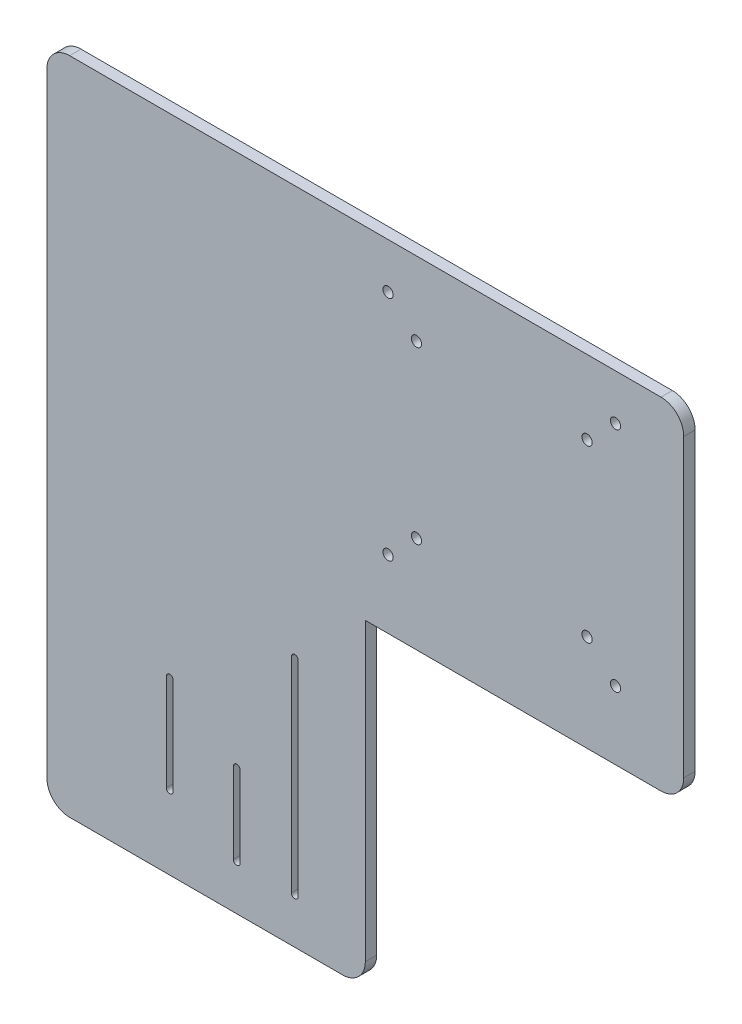
ISO-10303-21;
HEADER;
FILE_DESCRIPTION(('STEP AP214'),'2;1');
FILE_NAME('part.step','',(''),(''),'','','');
FILE_SCHEMA(('AUTOMOTIVE_DESIGN { 1 0 10303 214 1 1 1 1 }'));
ENDSEC;
DATA;
#1=APPLICATION_CONTEXT('core data for automotive mechanical design processes');
#2=APPLICATION_PROTOCOL_DEFINITION('international standard','automotive_design',2000,#1);
#3=PRODUCT_CONTEXT('',#1,'mechanical');
#4=PRODUCT('Part','Part','',(#3));
#5=PRODUCT_RELATED_PRODUCT_CATEGORY('part','',(#4));
#6=PRODUCT_DEFINITION_FORMATION('','',#4);
#7=PRODUCT_DEFINITION_CONTEXT('part definition',#1,'design');
#8=PRODUCT_DEFINITION('design','',#6,#7);
#9=PRODUCT_DEFINITION_SHAPE('','',#8);
#10=(LENGTH_UNIT() NAMED_UNIT(*) SI_UNIT(.MILLI.,.METRE.));
#11=(NAMED_UNIT(*) PLANE_ANGLE_UNIT() SI_UNIT($,.RADIAN.));
#12=(NAMED_UNIT(*) SI_UNIT($,.STERADIAN.) SOLID_ANGLE_UNIT());
#13=UNCERTAINTY_MEASURE_WITH_UNIT(LENGTH_MEASURE(1.E-05),#10,'distance_accuracy_value','');
#14=(GEOMETRIC_REPRESENTATION_CONTEXT(3) GLOBAL_UNCERTAINTY_ASSIGNED_CONTEXT((#13)) GLOBAL_UNIT_ASSIGNED_CONTEXT((#10,
#11,#12)) REPRESENTATION_CONTEXT('',''));
#15=CARTESIAN_POINT('',(0.,0.,0.));
#16=DIRECTION('',(0.,0.,1.));
#17=DIRECTION('',(1.,0.,0.));
#18=AXIS2_PLACEMENT_3D('',#15,#16,#17);
#19=CARTESIAN_POINT('',(-270.,-280.,5.));
#20=DIRECTION('',(0.,0.,-1.));
#21=DIRECTION('',(-1.,0.,0.));
#22=AXIS2_PLACEMENT_3D('',#19,#20,#21);
#23=CYLINDRICAL_SURFACE('',#22,10.);
#24=CARTESIAN_POINT('',(-270.,-280.,0.));
#25=DIRECTION('',(0.,0.,1.));
#26=DIRECTION('',(-1.,0.,0.));
#27=AXIS2_PLACEMENT_3D('',#24,#25,#26);
#28=CIRCLE('',#27,10.);
#29=CARTESIAN_POINT('',(-280.,-280.,0.));
#30=VERTEX_POINT('',#29);
#31=CARTESIAN_POINT('',(-270.,-290.,0.));
#32=VERTEX_POINT('',#31);
#33=EDGE_CURVE('E345',#30,#32,#28,.T.);
#34=ORIENTED_EDGE('',*,*,#33,.T.);
#35=DIRECTION('',(0.,0.,-1.));
#36=VECTOR('',#35,1.);
#37=CARTESIAN_POINT('',(-270.,-290.,5.));
#38=LINE('',#37,#36);
#39=CARTESIAN_POINT('',(-270.,-290.,5.));
#40=VERTEX_POINT('',#39);
#41=EDGE_CURVE('E11',#40,#32,#38,.T.);
#42=ORIENTED_EDGE('',*,*,#41,.F.);
#43=CARTESIAN_POINT('',(-270.,-280.,5.));
#44=DIRECTION('',(0.,0.,1.));
#45=DIRECTION('',(-1.,0.,0.));
#46=AXIS2_PLACEMENT_3D('',#43,#44,#45);
#47=CIRCLE('',#46,10.);
#48=CARTESIAN_POINT('',(-280.,-280.,5.));
#49=VERTEX_POINT('',#48);
#50=EDGE_CURVE('E320',#49,#40,#47,.T.);
#51=ORIENTED_EDGE('',*,*,#50,.F.);
#52=DIRECTION('',(0.,0.,-1.));
#53=VECTOR('',#52,1.);
#54=CARTESIAN_POINT('',(-280.,-280.,5.));
#55=LINE('',#54,#53);
#56=EDGE_CURVE('E344',#49,#30,#55,.T.);
#57=ORIENTED_EDGE('',*,*,#56,.T.);
#58=EDGE_LOOP('',(#34,#42,#51,#57));
#59=FACE_BOUND('',#58,.T.);
#60=ADVANCED_FACE('F33',(#59),#23,.T.);
#61=CARTESIAN_POINT('',(-270.,-290.,5.));
#62=DIRECTION('',(0.,1.,0.));
#63=DIRECTION('',(0.,0.,1.));
#64=AXIS2_PLACEMENT_3D('',#61,#62,#63);
#65=PLANE('',#64);
#66=DIRECTION('',(1.,0.,0.));
#67=VECTOR('',#66,1.);
#68=CARTESIAN_POINT('',(-270.,-290.,0.));
#69=LINE('',#68,#67);
#70=CARTESIAN_POINT('',(-150.,-290.,0.));
#71=VERTEX_POINT('',#70);
#72=EDGE_CURVE('E348',#32,#71,#69,.T.);
#73=ORIENTED_EDGE('',*,*,#72,.T.);
#74=DIRECTION('',(0.,0.,-1.));
#75=VECTOR('',#74,1.);
#76=CARTESIAN_POINT('',(-150.,-290.,5.));
#77=LINE('',#76,#75);
#78=CARTESIAN_POINT('',(-150.,-290.,5.));
#79=VERTEX_POINT('',#78);
#80=EDGE_CURVE('E41',#79,#71,#77,.T.);
#81=ORIENTED_EDGE('',*,*,#80,.F.);
#82=DIRECTION('',(1.,0.,0.));
#83=VECTOR('',#82,1.);
#84=CARTESIAN_POINT('',(-270.,-290.,5.));
#85=LINE('',#84,#83);
#86=EDGE_CURVE('E323',#40,#79,#85,.T.);
#87=ORIENTED_EDGE('',*,*,#86,.F.);
#88=ORIENTED_EDGE('',*,*,#41,.T.);
#89=EDGE_LOOP('',(#73,#81,#87,#88));
#90=FACE_BOUND('',#89,.T.);
#91=ADVANCED_FACE('F480',(#90),#65,.F.);
#92=CARTESIAN_POINT('',(-150.,-280.,5.));
#93=DIRECTION('',(0.,0.,-1.));
#94=DIRECTION('',(-1.,0.,0.));
#95=AXIS2_PLACEMENT_3D('',#92,#93,#94);
#96=CYLINDRICAL_SURFACE('',#95,10.);
#97=CARTESIAN_POINT('',(-150.,-280.,0.));
#98=DIRECTION('',(0.,0.,1.));
#99=DIRECTION('',(1.,0.,0.));
#100=AXIS2_PLACEMENT_3D('',#97,#98,#99);
#101=CIRCLE('',#100,10.);
#102=CARTESIAN_POINT('',(-140.,-280.,0.));
#103=VERTEX_POINT('',#102);
#104=EDGE_CURVE('E350',#71,#103,#101,.T.);
#105=ORIENTED_EDGE('',*,*,#104,.T.);
#106=DIRECTION('',(0.,0.,-1.));
#107=VECTOR('',#106,1.);
#108=CARTESIAN_POINT('',(-140.,-280.,5.));
#109=LINE('',#108,#107);
#110=CARTESIAN_POINT('',(-140.,-280.,5.));
#111=VERTEX_POINT('',#110);
#112=EDGE_CURVE('E390',#111,#103,#109,.T.);
#113=ORIENTED_EDGE('',*,*,#112,.F.);
#114=CARTESIAN_POINT('',(-150.,-280.,5.));
#115=DIRECTION('',(0.,0.,1.));
#116=DIRECTION('',(1.,0.,0.));
#117=AXIS2_PLACEMENT_3D('',#114,#115,#116);
#118=CIRCLE('',#117,10.);
#119=EDGE_CURVE('E326',#79,#111,#118,.T.);
#120=ORIENTED_EDGE('',*,*,#119,.F.);
#121=ORIENTED_EDGE('',*,*,#80,.T.);
#122=EDGE_LOOP('',(#105,#113,#120,#121));
#123=FACE_BOUND('',#122,.T.);
#124=ADVANCED_FACE('F476',(#123),#96,.T.);
#125=CARTESIAN_POINT('',(-140.,-280.,5.));
#126=DIRECTION('',(-1.,0.,0.));
#127=DIRECTION('',(0.,0.,1.));
#128=AXIS2_PLACEMENT_3D('',#125,#126,#127);
#129=PLANE('',#128);
#130=DIRECTION('',(0.,1.,0.));
#131=VECTOR('',#130,1.);
#132=CARTESIAN_POINT('',(-140.,-280.,0.));
#133=LINE('',#132,#131);
#134=CARTESIAN_POINT('',(-140.,-150.,0.));
#135=VERTEX_POINT('',#134);
#136=EDGE_CURVE('E352',#103,#135,#133,.T.);
#137=ORIENTED_EDGE('',*,*,#136,.T.);
#138=DIRECTION('',(0.,0.,-1.));
#139=VECTOR('',#138,1.);
#140=CARTESIAN_POINT('',(-140.,-150.,5.));
#141=LINE('',#140,#139);
#142=CARTESIAN_POINT('',(-140.,-150.,5.));
#143=VERTEX_POINT('',#142);
#144=EDGE_CURVE('E387',#143,#135,#141,.T.);
#145=ORIENTED_EDGE('',*,*,#144,.F.);
#146=DIRECTION('',(0.,1.,0.));
#147=VECTOR('',#146,1.);
#148=CARTESIAN_POINT('',(-140.,-280.,5.));
#149=LINE('',#148,#147);
#150=EDGE_CURVE('E328',#111,#143,#149,.T.);
#151=ORIENTED_EDGE('',*,*,#150,.F.);
#152=ORIENTED_EDGE('',*,*,#112,.T.);
#153=EDGE_LOOP('',(#137,#145,#151,#152));
#154=FACE_BOUND('',#153,.T.);
#155=ADVANCED_FACE('F473',(#154),#129,.F.);
#156=CARTESIAN_POINT('',(-140.,-150.,5.));
#157=DIRECTION('',(0.,1.,0.));
#158=DIRECTION('',(0.,0.,1.));
#159=AXIS2_PLACEMENT_3D('',#156,#157,#158);
#160=PLANE('',#159);
#161=DIRECTION('',(1.,0.,0.));
#162=VECTOR('',#161,1.);
#163=CARTESIAN_POINT('',(-140.,-150.,0.));
#164=LINE('',#163,#162);
#165=CARTESIAN_POINT('',(-10.,-150.,0.));
#166=VERTEX_POINT('',#165);
#167=EDGE_CURVE('E354',#135,#166,#164,.T.);
#168=ORIENTED_EDGE('',*,*,#167,.T.);
#169=DIRECTION('',(0.,0.,-1.));
#170=VECTOR('',#169,1.);
#171=CARTESIAN_POINT('',(-10.,-150.,5.));
#172=LINE('',#171,#170);
#173=CARTESIAN_POINT('',(-10.,-150.,5.));
#174=VERTEX_POINT('',#173);
#175=EDGE_CURVE('E384',#174,#166,#172,.T.);
#176=ORIENTED_EDGE('',*,*,#175,.F.);
#177=DIRECTION('',(1.,0.,0.));
#178=VECTOR('',#177,1.);
#179=CARTESIAN_POINT('',(-140.,-150.,5.));
#180=LINE('',#179,#178);
#181=EDGE_CURVE('E330',#143,#174,#180,.T.);
#182=ORIENTED_EDGE('',*,*,#181,.F.);
#183=ORIENTED_EDGE('',*,*,#144,.T.);
#184=EDGE_LOOP('',(#168,#176,#182,#183));
#185=FACE_BOUND('',#184,.T.);
#186=ADVANCED_FACE('F469',(#185),#160,.F.);
#187=CARTESIAN_POINT('',(-10.,-140.,5.));
#188=DIRECTION('',(0.,0.,-1.));
#189=DIRECTION('',(-1.,0.,0.));
#190=AXIS2_PLACEMENT_3D('',#187,#188,#189);
#191=CYLINDRICAL_SURFACE('',#190,10.);
#192=CARTESIAN_POINT('',(-10.,-140.,0.));
#193=DIRECTION('',(0.,0.,1.));
#194=DIRECTION('',(-1.,0.,0.));
#195=AXIS2_PLACEMENT_3D('',#192,#193,#194);
#196=CIRCLE('',#195,10.);
#197=CARTESIAN_POINT('',(0.,-140.,0.));
#198=VERTEX_POINT('',#197);
#199=EDGE_CURVE('E356',#166,#198,#196,.T.);
#200=ORIENTED_EDGE('',*,*,#199,.T.);
#201=DIRECTION('',(0.,0.,-1.));
#202=VECTOR('',#201,1.);
#203=CARTESIAN_POINT('',(0.,-140.,5.));
#204=LINE('',#203,#202);
#205=CARTESIAN_POINT('',(0.,-140.,5.));
#206=VERTEX_POINT('',#205);
#207=EDGE_CURVE('E381',#206,#198,#204,.T.);
#208=ORIENTED_EDGE('',*,*,#207,.F.);
#209=CARTESIAN_POINT('',(-10.,-140.,5.));
#210=DIRECTION('',(0.,0.,1.));
#211=DIRECTION('',(-1.,0.,0.));
#212=AXIS2_PLACEMENT_3D('',#209,#210,#211);
#213=CIRCLE('',#212,10.);
#214=EDGE_CURVE('E332',#174,#206,#213,.T.);
#215=ORIENTED_EDGE('',*,*,#214,.F.);
#216=ORIENTED_EDGE('',*,*,#175,.T.);
#217=EDGE_LOOP('',(#200,#208,#215,#216));
#218=FACE_BOUND('',#217,.T.);
#219=ADVANCED_FACE('F464',(#218),#191,.T.);
#220=CARTESIAN_POINT('',(0.,-140.,5.));
#221=DIRECTION('',(-1.,0.,0.));
#222=DIRECTION('',(0.,0.,1.));
#223=AXIS2_PLACEMENT_3D('',#220,#221,#222);
#224=PLANE('',#223);
#225=DIRECTION('',(0.,1.,0.));
#226=VECTOR('',#225,1.);
#227=CARTESIAN_POINT('',(0.,-140.,0.));
#228=LINE('',#227,#226);
#229=CARTESIAN_POINT('',(0.,-10.0000000000001,0.));
#230=VERTEX_POINT('',#229);
#231=EDGE_CURVE('E358',#198,#230,#228,.T.);
#232=ORIENTED_EDGE('',*,*,#231,.T.);
#233=DIRECTION('',(0.,0.,-1.));
#234=VECTOR('',#233,1.);
#235=CARTESIAN_POINT('',(0.,-10.0000000000001,5.));
#236=LINE('',#235,#234);
#237=CARTESIAN_POINT('',(0.,-10.0000000000001,5.));
#238=VERTEX_POINT('',#237);
#239=EDGE_CURVE('E378',#238,#230,#236,.T.);
#240=ORIENTED_EDGE('',*,*,#239,.F.);
#241=DIRECTION('',(0.,1.,0.));
#242=VECTOR('',#241,1.);
#243=CARTESIAN_POINT('',(0.,-140.,5.));
#244=LINE('',#243,#242);
#245=EDGE_CURVE('E334',#206,#238,#244,.T.);
#246=ORIENTED_EDGE('',*,*,#245,.F.);
#247=ORIENTED_EDGE('',*,*,#207,.T.);
#248=EDGE_LOOP('',(#232,#240,#246,#247));
#249=FACE_BOUND('',#248,.T.);
#250=ADVANCED_FACE('F458',(#249),#224,.F.);
#251=CARTESIAN_POINT('',(-10.,-10.,5.));
#252=DIRECTION('',(0.,0.,-1.));
#253=DIRECTION('',(-1.,0.,0.));
#254=AXIS2_PLACEMENT_3D('',#251,#252,#253);
#255=CYLINDRICAL_SURFACE('',#254,10.);
#256=CARTESIAN_POINT('',(-10.,-10.,0.));
#257=DIRECTION('',(0.,0.,1.));
#258=DIRECTION('',(-1.,0.,0.));
#259=AXIS2_PLACEMENT_3D('',#256,#257,#258);
#260=CIRCLE('',#259,10.);
#261=CARTESIAN_POINT('',(-10.0000000000001,0.,0.));
#262=VERTEX_POINT('',#261);
#263=EDGE_CURVE('E360',#230,#262,#260,.T.);
#264=ORIENTED_EDGE('',*,*,#263,.T.);
#265=DIRECTION('',(0.,0.,-1.));
#266=VECTOR('',#265,1.);
#267=CARTESIAN_POINT('',(-10.0000000000001,0.,5.));
#268=LINE('',#267,#266);
#269=CARTESIAN_POINT('',(-10.0000000000001,0.,5.));
#270=VERTEX_POINT('',#269);
#271=EDGE_CURVE('E375',#270,#262,#268,.T.);
#272=ORIENTED_EDGE('',*,*,#271,.F.);
#273=CARTESIAN_POINT('',(-10.,-10.,5.));
#274=DIRECTION('',(0.,0.,1.));
#275=DIRECTION('',(-1.,0.,0.));
#276=AXIS2_PLACEMENT_3D('',#273,#274,#275);
#277=CIRCLE('',#276,10.);
#278=EDGE_CURVE('E336',#238,#270,#277,.T.);
#279=ORIENTED_EDGE('',*,*,#278,.F.);
#280=ORIENTED_EDGE('',*,*,#239,.T.);
#281=EDGE_LOOP('',(#264,#272,#279,#280));
#282=FACE_BOUND('',#281,.T.);
#283=ADVANCED_FACE('F454',(#282),#255,.T.);
#284=CARTESIAN_POINT('',(-10.0000000000001,0.,5.));
#285=DIRECTION('',(0.,-1.,0.));
#286=DIRECTION('',(1.,0.,0.));
#287=AXIS2_PLACEMENT_3D('',#284,#285,#286);
#288=PLANE('',#287);
#289=DIRECTION('',(-1.,0.,0.));
#290=VECTOR('',#289,1.);
#291=CARTESIAN_POINT('',(-10.0000000000001,0.,0.));
#292=LINE('',#291,#290);
#293=CARTESIAN_POINT('',(-270.,0.,0.));
#294=VERTEX_POINT('',#293);
#295=EDGE_CURVE('E362',#262,#294,#292,.T.);
#296=ORIENTED_EDGE('',*,*,#295,.T.);
#297=DIRECTION('',(0.,0.,-1.));
#298=VECTOR('',#297,1.);
#299=CARTESIAN_POINT('',(-270.,0.,5.));
#300=LINE('',#299,#298);
#301=CARTESIAN_POINT('',(-270.,0.,5.));
#302=VERTEX_POINT('',#301);
#303=EDGE_CURVE('E372',#302,#294,#300,.T.);
#304=ORIENTED_EDGE('',*,*,#303,.F.);
#305=DIRECTION('',(-1.,0.,0.));
#306=VECTOR('',#305,1.);
#307=CARTESIAN_POINT('',(-10.0000000000001,0.,5.));
#308=LINE('',#307,#306);
#309=EDGE_CURVE('E338',#270,#302,#308,.T.);
#310=ORIENTED_EDGE('',*,*,#309,.F.);
#311=ORIENTED_EDGE('',*,*,#271,.T.);
#312=EDGE_LOOP('',(#296,#304,#310,#311));
#313=FACE_BOUND('',#312,.T.);
#314=ADVANCED_FACE('F449',(#313),#288,.F.);
#315=CARTESIAN_POINT('',(-270.,-10.,5.));
#316=DIRECTION('',(0.,0.,-1.));
#317=DIRECTION('',(-1.,0.,0.));
#318=AXIS2_PLACEMENT_3D('',#315,#316,#317);
#319=CYLINDRICAL_SURFACE('',#318,10.);
#320=CARTESIAN_POINT('',(-270.,-10.,0.));
#321=DIRECTION('',(0.,0.,1.));
#322=DIRECTION('',(-1.,0.,0.));
#323=AXIS2_PLACEMENT_3D('',#320,#321,#322);
#324=CIRCLE('',#323,10.);
#325=CARTESIAN_POINT('',(-280.,-10.,0.));
#326=VERTEX_POINT('',#325);
#327=EDGE_CURVE('E364',#294,#326,#324,.T.);
#328=ORIENTED_EDGE('',*,*,#327,.T.);
#329=DIRECTION('',(0.,0.,-1.));
#330=VECTOR('',#329,1.);
#331=CARTESIAN_POINT('',(-280.,-10.,5.));
#332=LINE('',#331,#330);
#333=CARTESIAN_POINT('',(-280.,-10.,5.));
#334=VERTEX_POINT('',#333);
#335=EDGE_CURVE('E369',#334,#326,#332,.T.);
#336=ORIENTED_EDGE('',*,*,#335,.F.);
#337=CARTESIAN_POINT('',(-270.,-10.,5.));
#338=DIRECTION('',(0.,0.,1.));
#339=DIRECTION('',(-1.,0.,0.));
#340=AXIS2_PLACEMENT_3D('',#337,#338,#339);
#341=CIRCLE('',#340,10.);
#342=EDGE_CURVE('E340',#302,#334,#341,.T.);
#343=ORIENTED_EDGE('',*,*,#342,.F.);
#344=ORIENTED_EDGE('',*,*,#303,.T.);
#345=EDGE_LOOP('',(#328,#336,#343,#344));
#346=FACE_BOUND('',#345,.T.);
#347=ADVANCED_FACE('F443',(#346),#319,.T.);
#348=CARTESIAN_POINT('',(-280.,-10.,5.));
#349=DIRECTION('',(1.,0.,0.));
#350=DIRECTION('',(0.,1.,0.));
#351=AXIS2_PLACEMENT_3D('',#348,#349,#350);
#352=PLANE('',#351);
#353=DIRECTION('',(0.,-1.,0.));
#354=VECTOR('',#353,1.);
#355=CARTESIAN_POINT('',(-280.,-10.,0.));
#356=LINE('',#355,#354);
#357=EDGE_CURVE('E324',#326,#30,#356,.T.);
#358=ORIENTED_EDGE('',*,*,#357,.T.);
#359=ORIENTED_EDGE('',*,*,#56,.F.);
#360=DIRECTION('',(0.,-1.,0.));
#361=VECTOR('',#360,1.);
#362=CARTESIAN_POINT('',(-280.,-10.,5.));
#363=LINE('',#362,#361);
#364=EDGE_CURVE('E342',#334,#49,#363,.T.);
#365=ORIENTED_EDGE('',*,*,#364,.F.);
#366=ORIENTED_EDGE('',*,*,#335,.T.);
#367=EDGE_LOOP('',(#358,#359,#365,#366));
#368=FACE_BOUND('',#367,.T.);
#369=ADVANCED_FACE('F439',(#368),#352,.F.);
#370=CARTESIAN_POINT('',(-270.,-280.,5.));
#371=DIRECTION('',(0.,0.,-1.));
#372=DIRECTION('',(-1.,0.,0.));
#373=AXIS2_PLACEMENT_3D('',#370,#371,#372);
#374=PLANE('',#373);
#375=DIRECTION('',(0.,1.,0.));
#376=VECTOR('',#375,1.);
#377=CARTESIAN_POINT('',(-224.5,-257.5,5.));
#378=LINE('',#377,#376);
#379=CARTESIAN_POINT('',(-224.5,-257.5,5.));
#380=VERTEX_POINT('',#379);
#381=CARTESIAN_POINT('',(-224.5,-215.,5.));
#382=VERTEX_POINT('',#381);
#383=EDGE_CURVE('E216',#380,#382,#378,.T.);
#384=ORIENTED_EDGE('',*,*,#383,.F.);
#385=CARTESIAN_POINT('',(-226.,-257.5,5.));
#386=DIRECTION('',(0.,0.,1.));
#387=DIRECTION('',(1.,0.,0.));
#388=AXIS2_PLACEMENT_3D('',#385,#386,#387);
#389=CIRCLE('',#388,1.5);
#390=CARTESIAN_POINT('',(-227.5,-257.5,5.));
#391=VERTEX_POINT('',#390);
#392=EDGE_CURVE('E49',#391,#380,#389,.T.);
#393=ORIENTED_EDGE('',*,*,#392,.F.);
#394=DIRECTION('',(0.,-1.,0.));
#395=VECTOR('',#394,1.);
#396=CARTESIAN_POINT('',(-227.5,-257.5,5.));
#397=LINE('',#396,#395);
#398=CARTESIAN_POINT('',(-227.5,-215.,5.));
#399=VERTEX_POINT('',#398);
#400=EDGE_CURVE('E207',#399,#391,#397,.T.);
#401=ORIENTED_EDGE('',*,*,#400,.F.);
#402=CARTESIAN_POINT('',(-226.,-215.,5.));
#403=DIRECTION('',(0.,0.,1.));
#404=DIRECTION('',(1.,0.,0.));
#405=AXIS2_PLACEMENT_3D('',#402,#403,#404);
#406=CIRCLE('',#405,1.5);
#407=EDGE_CURVE('E210',#382,#399,#406,.T.);
#408=ORIENTED_EDGE('',*,*,#407,.F.);
#409=EDGE_LOOP('',(#384,#393,#401,#408));
#410=FACE_BOUND('',#409,.T.);
#411=DIRECTION('',(0.,1.,0.));
#412=VECTOR('',#411,1.);
#413=CARTESIAN_POINT('',(-195.,-270.,5.));
#414=LINE('',#413,#412);
#415=CARTESIAN_POINT('',(-195.,-270.,5.));
#416=VERTEX_POINT('',#415);
#417=CARTESIAN_POINT('',(-195.,-234.5,5.));
#418=VERTEX_POINT('',#417);
#419=EDGE_CURVE('E241',#416,#418,#414,.T.);
#420=ORIENTED_EDGE('',*,*,#419,.F.);
#421=CARTESIAN_POINT('',(-196.5,-270.,5.));
#422=DIRECTION('',(0.,0.,1.));
#423=DIRECTION('',(1.,0.,0.));
#424=AXIS2_PLACEMENT_3D('',#421,#422,#423);
#425=CIRCLE('',#424,1.5);
#426=CARTESIAN_POINT('',(-198.,-270.,5.));
#427=VERTEX_POINT('',#426);
#428=EDGE_CURVE('E222',#427,#416,#425,.T.);
#429=ORIENTED_EDGE('',*,*,#428,.F.);
#430=DIRECTION('',(0.,-1.,0.));
#431=VECTOR('',#430,1.);
#432=CARTESIAN_POINT('',(-198.,-270.,5.));
#433=LINE('',#432,#431);
#434=CARTESIAN_POINT('',(-198.,-234.5,5.));
#435=VERTEX_POINT('',#434);
#436=EDGE_CURVE('E230',#435,#427,#433,.T.);
#437=ORIENTED_EDGE('',*,*,#436,.F.);
#438=CARTESIAN_POINT('',(-196.5,-234.5,5.));
#439=DIRECTION('',(0.,0.,1.));
#440=DIRECTION('',(1.,0.,0.));
#441=AXIS2_PLACEMENT_3D('',#438,#439,#440);
#442=CIRCLE('',#441,1.5);
#443=EDGE_CURVE('E244',#418,#435,#442,.T.);
#444=ORIENTED_EDGE('',*,*,#443,.F.);
#445=EDGE_LOOP('',(#420,#429,#437,#444));
#446=FACE_BOUND('',#445,.T.);
#447=DIRECTION('',(0.,1.,0.));
#448=VECTOR('',#447,1.);
#449=CARTESIAN_POINT('',(-169.5,-270.,5.));
#450=LINE('',#449,#448);
#451=CARTESIAN_POINT('',(-169.5,-270.,5.));
#452=VERTEX_POINT('',#451);
#453=CARTESIAN_POINT('',(-169.5,-180.,5.));
#454=VERTEX_POINT('',#453);
#455=EDGE_CURVE('E273',#452,#454,#450,.T.);
#456=ORIENTED_EDGE('',*,*,#455,.F.);
#457=CARTESIAN_POINT('',(-171.,-270.,5.));
#458=DIRECTION('',(0.,0.,1.));
#459=DIRECTION('',(1.,0.,0.));
#460=AXIS2_PLACEMENT_3D('',#457,#458,#459);
#461=CIRCLE('',#460,1.49999999999997);
#462=CARTESIAN_POINT('',(-172.5,-270.,5.));
#463=VERTEX_POINT('',#462);
#464=EDGE_CURVE('E251',#463,#452,#461,.T.);
#465=ORIENTED_EDGE('',*,*,#464,.F.);
#466=DIRECTION('',(0.,-1.,0.));
#467=VECTOR('',#466,1.);
#468=CARTESIAN_POINT('',(-172.5,-270.,5.));
#469=LINE('',#468,#467);
#470=CARTESIAN_POINT('',(-172.5,-180.,5.));
#471=VERTEX_POINT('',#470);
#472=EDGE_CURVE('E262',#471,#463,#469,.T.);
#473=ORIENTED_EDGE('',*,*,#472,.F.);
#474=CARTESIAN_POINT('',(-171.,-180.,5.));
#475=DIRECTION('',(0.,0.,1.));
#476=DIRECTION('',(1.,0.,0.));
#477=AXIS2_PLACEMENT_3D('',#474,#475,#476);
#478=CIRCLE('',#477,1.50000000000003);
#479=EDGE_CURVE('E276',#454,#471,#478,.T.);
#480=ORIENTED_EDGE('',*,*,#479,.F.);
#481=EDGE_LOOP('',(#456,#465,#473,#480));
#482=FACE_BOUND('',#481,.T.);
#483=CARTESIAN_POINT('',(-130.,-120.,5.));
#484=DIRECTION('',(0.,0.,1.));
#485=DIRECTION('',(1.,0.,0.));
#486=AXIS2_PLACEMENT_3D('',#483,#484,#485);
#487=CIRCLE('',#486,2.25);
#488=CARTESIAN_POINT('',(-127.75,-120.,5.));
#489=VERTEX_POINT('',#488);
#490=EDGE_CURVE('E283',#489,#489,#487,.T.);
#491=ORIENTED_EDGE('',*,*,#490,.F.);
#492=EDGE_LOOP('',(#491));
#493=FACE_BOUND('',#492,.T.);
#494=CARTESIAN_POINT('',(-30.,-119.999999999999,5.));
#495=DIRECTION('',(0.,0.,1.));
#496=DIRECTION('',(1.,0.,0.));
#497=AXIS2_PLACEMENT_3D('',#494,#495,#496);
#498=CIRCLE('',#497,2.25);
#499=CARTESIAN_POINT('',(-27.75,-119.999999999999,5.));
#500=VERTEX_POINT('',#499);
#501=EDGE_CURVE('E292',#500,#500,#498,.T.);
#502=ORIENTED_EDGE('',*,*,#501,.F.);
#503=EDGE_LOOP('',(#502));
#504=FACE_BOUND('',#503,.T.);
#505=CARTESIAN_POINT('',(-30.0000000000003,-19.9999999999986,5.));
#506=DIRECTION('',(0.,0.,1.));
#507=DIRECTION('',(1.,0.,0.));
#508=AXIS2_PLACEMENT_3D('',#505,#506,#507);
#509=CIRCLE('',#508,2.25);
#510=CARTESIAN_POINT('',(-27.7500000000003,-19.9999999999986,5.));
#511=VERTEX_POINT('',#510);
#512=EDGE_CURVE('E296',#511,#511,#509,.T.);
#513=ORIENTED_EDGE('',*,*,#512,.F.);
#514=EDGE_LOOP('',(#513));
#515=FACE_BOUND('',#514,.T.);
#516=CARTESIAN_POINT('',(-130.,-20.,5.));
#517=DIRECTION('',(0.,0.,1.));
#518=DIRECTION('',(1.,0.,0.));
#519=AXIS2_PLACEMENT_3D('',#516,#517,#518);
#520=CIRCLE('',#519,2.25);
#521=CARTESIAN_POINT('',(-127.75,-20.,5.));
#522=VERTEX_POINT('',#521);
#523=EDGE_CURVE('E300',#522,#522,#520,.T.);
#524=ORIENTED_EDGE('',*,*,#523,.F.);
#525=EDGE_LOOP('',(#524));
#526=FACE_BOUND('',#525,.T.);
#527=CARTESIAN_POINT('',(-117.5,-107.5,5.));
#528=DIRECTION('',(0.,0.,1.));
#529=DIRECTION('',(1.,0.,0.));
#530=AXIS2_PLACEMENT_3D('',#527,#528,#529);
#531=CIRCLE('',#530,2.25);
#532=CARTESIAN_POINT('',(-115.25,-107.5,5.));
#533=VERTEX_POINT('',#532);
#534=EDGE_CURVE('E304',#533,#533,#531,.T.);
#535=ORIENTED_EDGE('',*,*,#534,.F.);
#536=EDGE_LOOP('',(#535));
#537=FACE_BOUND('',#536,.T.);
#538=CARTESIAN_POINT('',(-42.5,-107.5,5.));
#539=DIRECTION('',(0.,0.,1.));
#540=DIRECTION('',(1.,0.,0.));
#541=AXIS2_PLACEMENT_3D('',#538,#539,#540);
#542=CIRCLE('',#541,2.25);
#543=CARTESIAN_POINT('',(-40.25,-107.5,5.));
#544=VERTEX_POINT('',#543);
#545=EDGE_CURVE('E308',#544,#544,#542,.T.);
#546=ORIENTED_EDGE('',*,*,#545,.F.);
#547=EDGE_LOOP('',(#546));
#548=FACE_BOUND('',#547,.T.);
#549=CARTESIAN_POINT('',(-42.5000000000003,-32.5,5.));
#550=DIRECTION('',(0.,0.,1.));
#551=DIRECTION('',(1.,0.,0.));
#552=AXIS2_PLACEMENT_3D('',#549,#550,#551);
#553=CIRCLE('',#552,2.25);
#554=CARTESIAN_POINT('',(-40.2500000000003,-32.5,5.));
#555=VERTEX_POINT('',#554);
#556=EDGE_CURVE('E312',#555,#555,#553,.T.);
#557=ORIENTED_EDGE('',*,*,#556,.F.);
#558=EDGE_LOOP('',(#557));
#559=FACE_BOUND('',#558,.T.);
#560=CARTESIAN_POINT('',(-117.5,-32.5,5.));
#561=DIRECTION('',(0.,0.,1.));
#562=DIRECTION('',(1.,0.,0.));
#563=AXIS2_PLACEMENT_3D('',#560,#561,#562);
#564=CIRCLE('',#563,2.25);
#565=CARTESIAN_POINT('',(-115.25,-32.5,5.));
#566=VERTEX_POINT('',#565);
#567=EDGE_CURVE('E316',#566,#566,#564,.T.);
#568=ORIENTED_EDGE('',*,*,#567,.F.);
#569=EDGE_LOOP('',(#568));
#570=FACE_BOUND('',#569,.T.);
#571=ORIENTED_EDGE('',*,*,#50,.T.);
#572=ORIENTED_EDGE('',*,*,#86,.T.);
#573=ORIENTED_EDGE('',*,*,#119,.T.);
#574=ORIENTED_EDGE('',*,*,#150,.T.);
#575=ORIENTED_EDGE('',*,*,#181,.T.);
#576=ORIENTED_EDGE('',*,*,#214,.T.);
#577=ORIENTED_EDGE('',*,*,#245,.T.);
#578=ORIENTED_EDGE('',*,*,#278,.T.);
#579=ORIENTED_EDGE('',*,*,#309,.T.);
#580=ORIENTED_EDGE('',*,*,#342,.T.);
#581=ORIENTED_EDGE('',*,*,#364,.T.);
#582=EDGE_LOOP('',(#571,#572,#573,#574,#575,#576,#577,#578,#579,#580,#581));
#583=FACE_BOUND('',#582,.T.);
#584=ADVANCED_FACE('F415',(#410,#446,#482,#493,#504,#515,#526,#537,#548,#559,#570,#583),#374,.F.);
#585=CARTESIAN_POINT('',(-270.,-280.,0.));
#586=DIRECTION('',(0.,0.,-1.));
#587=DIRECTION('',(-1.,0.,0.));
#588=AXIS2_PLACEMENT_3D('',#585,#586,#587);
#589=PLANE('',#588);
#590=CARTESIAN_POINT('',(-226.,-257.5,0.));
#591=DIRECTION('',(0.,0.,1.));
#592=DIRECTION('',(1.,0.,0.));
#593=AXIS2_PLACEMENT_3D('',#590,#591,#592);
#594=CIRCLE('',#593,1.5);
#595=CARTESIAN_POINT('',(-227.5,-257.5,0.));
#596=VERTEX_POINT('',#595);
#597=CARTESIAN_POINT('',(-224.5,-257.5,0.));
#598=VERTEX_POINT('',#597);
#599=EDGE_CURVE('E191',#596,#598,#594,.T.);
#600=ORIENTED_EDGE('',*,*,#599,.T.);
#601=DIRECTION('',(0.,1.,0.));
#602=VECTOR('',#601,1.);
#603=CARTESIAN_POINT('',(-224.5,-257.5,0.));
#604=LINE('',#603,#602);
#605=CARTESIAN_POINT('',(-224.5,-215.,0.));
#606=VERTEX_POINT('',#605);
#607=EDGE_CURVE('E200',#598,#606,#604,.T.);
#608=ORIENTED_EDGE('',*,*,#607,.T.);
#609=CARTESIAN_POINT('',(-226.,-215.,0.));
#610=DIRECTION('',(0.,0.,1.));
#611=DIRECTION('',(1.,0.,0.));
#612=AXIS2_PLACEMENT_3D('',#609,#610,#611);
#613=CIRCLE('',#612,1.5);
#614=CARTESIAN_POINT('',(-227.5,-215.,0.));
#615=VERTEX_POINT('',#614);
#616=EDGE_CURVE('E57',#606,#615,#613,.T.);
#617=ORIENTED_EDGE('',*,*,#616,.T.);
#618=DIRECTION('',(0.,-1.,0.));
#619=VECTOR('',#618,1.);
#620=CARTESIAN_POINT('',(-227.5,-257.5,0.));
#621=LINE('',#620,#619);
#622=EDGE_CURVE('E197',#615,#596,#621,.T.);
#623=ORIENTED_EDGE('',*,*,#622,.T.);
#624=EDGE_LOOP('',(#600,#608,#617,#623));
#625=FACE_BOUND('',#624,.T.);
#626=CARTESIAN_POINT('',(-196.5,-270.,0.));
#627=DIRECTION('',(0.,0.,1.));
#628=DIRECTION('',(1.,0.,0.));
#629=AXIS2_PLACEMENT_3D('',#626,#627,#628);
#630=CIRCLE('',#629,1.5);
#631=CARTESIAN_POINT('',(-198.,-270.,0.));
#632=VERTEX_POINT('',#631);
#633=CARTESIAN_POINT('',(-195.,-270.,0.));
#634=VERTEX_POINT('',#633);
#635=EDGE_CURVE('E226',#632,#634,#630,.T.);
#636=ORIENTED_EDGE('',*,*,#635,.T.);
#637=DIRECTION('',(0.,1.,0.));
#638=VECTOR('',#637,1.);
#639=CARTESIAN_POINT('',(-195.,-270.,0.));
#640=LINE('',#639,#638);
#641=CARTESIAN_POINT('',(-195.,-234.5,0.));
#642=VERTEX_POINT('',#641);
#643=EDGE_CURVE('E229',#634,#642,#640,.T.);
#644=ORIENTED_EDGE('',*,*,#643,.T.);
#645=CARTESIAN_POINT('',(-196.5,-234.5,0.));
#646=DIRECTION('',(0.,0.,1.));
#647=DIRECTION('',(1.,0.,0.));
#648=AXIS2_PLACEMENT_3D('',#645,#646,#647);
#649=CIRCLE('',#648,1.5);
#650=CARTESIAN_POINT('',(-198.,-234.5,0.));
#651=VERTEX_POINT('',#650);
#652=EDGE_CURVE('E233',#642,#651,#649,.T.);
#653=ORIENTED_EDGE('',*,*,#652,.T.);
#654=DIRECTION('',(0.,-1.,0.));
#655=VECTOR('',#654,1.);
#656=CARTESIAN_POINT('',(-198.,-270.,0.));
#657=LINE('',#656,#655);
#658=EDGE_CURVE('E236',#651,#632,#657,.T.);
#659=ORIENTED_EDGE('',*,*,#658,.T.);
#660=EDGE_LOOP('',(#636,#644,#653,#659));
#661=FACE_BOUND('',#660,.T.);
#662=CARTESIAN_POINT('',(-171.,-270.,0.));
#663=DIRECTION('',(0.,0.,1.));
#664=DIRECTION('',(1.,0.,0.));
#665=AXIS2_PLACEMENT_3D('',#662,#663,#664);
#666=CIRCLE('',#665,1.49999999999997);
#667=CARTESIAN_POINT('',(-172.5,-270.,0.));
#668=VERTEX_POINT('',#667);
#669=CARTESIAN_POINT('',(-169.5,-270.,0.));
#670=VERTEX_POINT('',#669);
#671=EDGE_CURVE('E258',#668,#670,#666,.T.);
#672=ORIENTED_EDGE('',*,*,#671,.T.);
#673=DIRECTION('',(0.,1.,0.));
#674=VECTOR('',#673,1.);
#675=CARTESIAN_POINT('',(-169.5,-270.,0.));
#676=LINE('',#675,#674);
#677=CARTESIAN_POINT('',(-169.5,-180.,0.));
#678=VERTEX_POINT('',#677);
#679=EDGE_CURVE('E261',#670,#678,#676,.T.);
#680=ORIENTED_EDGE('',*,*,#679,.T.);
#681=CARTESIAN_POINT('',(-171.,-180.,0.));
#682=DIRECTION('',(0.,0.,1.));
#683=DIRECTION('',(1.,0.,0.));
#684=AXIS2_PLACEMENT_3D('',#681,#682,#683);
#685=CIRCLE('',#684,1.50000000000003);
#686=CARTESIAN_POINT('',(-172.5,-180.,0.));
#687=VERTEX_POINT('',#686);
#688=EDGE_CURVE('E265',#678,#687,#685,.T.);
#689=ORIENTED_EDGE('',*,*,#688,.T.);
#690=DIRECTION('',(0.,-1.,0.));
#691=VECTOR('',#690,1.);
#692=CARTESIAN_POINT('',(-172.5,-270.,0.));
#693=LINE('',#692,#691);
#694=EDGE_CURVE('E268',#687,#668,#693,.T.);
#695=ORIENTED_EDGE('',*,*,#694,.T.);
#696=EDGE_LOOP('',(#672,#680,#689,#695));
#697=FACE_BOUND('',#696,.T.);
#698=CARTESIAN_POINT('',(-130.,-120.,0.));
#699=DIRECTION('',(0.,0.,-1.));
#700=DIRECTION('',(-1.,0.,0.));
#701=AXIS2_PLACEMENT_3D('',#698,#699,#700);
#702=CIRCLE('',#701,2.25);
#703=CARTESIAN_POINT('',(-132.25,-120.,0.));
#704=VERTEX_POINT('',#703);
#705=EDGE_CURVE('E36',#704,#704,#702,.T.);
#706=ORIENTED_EDGE('',*,*,#705,.F.);
#707=EDGE_LOOP('',(#706));
#708=FACE_BOUND('',#707,.T.);
#709=CARTESIAN_POINT('',(-30.,-119.999999999999,0.));
#710=DIRECTION('',(0.,0.,-1.));
#711=DIRECTION('',(-1.,0.,0.));
#712=AXIS2_PLACEMENT_3D('',#709,#710,#711);
#713=CIRCLE('',#712,2.25);
#714=CARTESIAN_POINT('',(-32.25,-119.999999999999,0.));
#715=VERTEX_POINT('',#714);
#716=EDGE_CURVE('E295',#715,#715,#713,.T.);
#717=ORIENTED_EDGE('',*,*,#716,.F.);
#718=EDGE_LOOP('',(#717));
#719=FACE_BOUND('',#718,.T.);
#720=CARTESIAN_POINT('',(-30.0000000000003,-19.9999999999986,0.));
#721=DIRECTION('',(0.,0.,-1.));
#722=DIRECTION('',(-1.,0.,0.));
#723=AXIS2_PLACEMENT_3D('',#720,#721,#722);
#724=CIRCLE('',#723,2.25);
#725=CARTESIAN_POINT('',(-32.2500000000003,-19.9999999999986,0.));
#726=VERTEX_POINT('',#725);
#727=EDGE_CURVE('E299',#726,#726,#724,.T.);
#728=ORIENTED_EDGE('',*,*,#727,.F.);
#729=EDGE_LOOP('',(#728));
#730=FACE_BOUND('',#729,.T.);
#731=CARTESIAN_POINT('',(-130.,-20.,0.));
#732=DIRECTION('',(0.,0.,-1.));
#733=DIRECTION('',(-1.,0.,0.));
#734=AXIS2_PLACEMENT_3D('',#731,#732,#733);
#735=CIRCLE('',#734,2.25);
#736=CARTESIAN_POINT('',(-132.25,-20.,0.));
#737=VERTEX_POINT('',#736);
#738=EDGE_CURVE('E303',#737,#737,#735,.T.);
#739=ORIENTED_EDGE('',*,*,#738,.F.);
#740=EDGE_LOOP('',(#739));
#741=FACE_BOUND('',#740,.T.);
#742=CARTESIAN_POINT('',(-117.5,-107.5,0.));
#743=DIRECTION('',(0.,0.,-1.));
#744=DIRECTION('',(-1.,0.,0.));
#745=AXIS2_PLACEMENT_3D('',#742,#743,#744);
#746=CIRCLE('',#745,2.25);
#747=CARTESIAN_POINT('',(-119.75,-107.5,0.));
#748=VERTEX_POINT('',#747);
#749=EDGE_CURVE('E307',#748,#748,#746,.T.);
#750=ORIENTED_EDGE('',*,*,#749,.F.);
#751=EDGE_LOOP('',(#750));
#752=FACE_BOUND('',#751,.T.);
#753=CARTESIAN_POINT('',(-42.5,-107.5,0.));
#754=DIRECTION('',(0.,0.,-1.));
#755=DIRECTION('',(-1.,0.,0.));
#756=AXIS2_PLACEMENT_3D('',#753,#754,#755);
#757=CIRCLE('',#756,2.25);
#758=CARTESIAN_POINT('',(-44.75,-107.5,0.));
#759=VERTEX_POINT('',#758);
#760=EDGE_CURVE('E311',#759,#759,#757,.T.);
#761=ORIENTED_EDGE('',*,*,#760,.F.);
#762=EDGE_LOOP('',(#761));
#763=FACE_BOUND('',#762,.T.);
#764=CARTESIAN_POINT('',(-42.5000000000003,-32.5,0.));
#765=DIRECTION('',(0.,0.,-1.));
#766=DIRECTION('',(-1.,0.,0.));
#767=AXIS2_PLACEMENT_3D('',#764,#765,#766);
#768=CIRCLE('',#767,2.25);
#769=CARTESIAN_POINT('',(-44.7500000000003,-32.5,0.));
#770=VERTEX_POINT('',#769);
#771=EDGE_CURVE('E315',#770,#770,#768,.T.);
#772=ORIENTED_EDGE('',*,*,#771,.F.);
#773=EDGE_LOOP('',(#772));
#774=FACE_BOUND('',#773,.T.);
#775=CARTESIAN_POINT('',(-117.5,-32.5,0.));
#776=DIRECTION('',(0.,0.,-1.));
#777=DIRECTION('',(-1.,0.,0.));
#778=AXIS2_PLACEMENT_3D('',#775,#776,#777);
#779=CIRCLE('',#778,2.25);
#780=CARTESIAN_POINT('',(-119.75,-32.5,0.));
#781=VERTEX_POINT('',#780);
#782=EDGE_CURVE('E319',#781,#781,#779,.T.);
#783=ORIENTED_EDGE('',*,*,#782,.F.);
#784=EDGE_LOOP('',(#783));
#785=FACE_BOUND('',#784,.T.);
#786=ORIENTED_EDGE('',*,*,#33,.F.);
#787=ORIENTED_EDGE('',*,*,#357,.F.);
#788=ORIENTED_EDGE('',*,*,#327,.F.);
#789=ORIENTED_EDGE('',*,*,#295,.F.);
#790=ORIENTED_EDGE('',*,*,#263,.F.);
#791=ORIENTED_EDGE('',*,*,#231,.F.);
#792=ORIENTED_EDGE('',*,*,#199,.F.);
#793=ORIENTED_EDGE('',*,*,#167,.F.);
#794=ORIENTED_EDGE('',*,*,#136,.F.);
#795=ORIENTED_EDGE('',*,*,#104,.F.);
#796=ORIENTED_EDGE('',*,*,#72,.F.);
#797=EDGE_LOOP('',(#786,#787,#788,#789,#790,#791,#792,#793,#794,#795,#796));
#798=FACE_BOUND('',#797,.T.);
#799=ADVANCED_FACE('F204',(#625,#661,#697,#708,#719,#730,#741,#752,#763,#774,#785,#798),#589,.T.);
#800=CARTESIAN_POINT('',(-117.5,-32.5,5.));
#801=DIRECTION('',(0.,0.,1.));
#802=DIRECTION('',(1.,0.,0.));
#803=AXIS2_PLACEMENT_3D('',#800,#801,#802);
#804=CYLINDRICAL_SURFACE('',#803,2.25);
#805=ORIENTED_EDGE('',*,*,#782,.T.);
#806=EDGE_LOOP('',(#805));
#807=FACE_BOUND('',#806,.T.);
#808=ORIENTED_EDGE('',*,*,#567,.T.);
#809=EDGE_LOOP('',(#808));
#810=FACE_BOUND('',#809,.T.);
#811=ADVANCED_FACE('F414',(#807,#810),#804,.F.);
#812=CARTESIAN_POINT('',(-42.5000000000003,-32.5,5.));
#813=DIRECTION('',(0.,0.,1.));
#814=DIRECTION('',(1.,0.,0.));
#815=AXIS2_PLACEMENT_3D('',#812,#813,#814);
#816=CYLINDRICAL_SURFACE('',#815,2.25);
#817=ORIENTED_EDGE('',*,*,#771,.T.);
#818=EDGE_LOOP('',(#817));
#819=FACE_BOUND('',#818,.T.);
#820=ORIENTED_EDGE('',*,*,#556,.T.);
#821=EDGE_LOOP('',(#820));
#822=FACE_BOUND('',#821,.T.);
#823=ADVANCED_FACE('F531',(#819,#822),#816,.F.);
#824=CARTESIAN_POINT('',(-42.5,-107.5,5.));
#825=DIRECTION('',(0.,0.,1.));
#826=DIRECTION('',(1.,0.,0.));
#827=AXIS2_PLACEMENT_3D('',#824,#825,#826);
#828=CYLINDRICAL_SURFACE('',#827,2.25);
#829=ORIENTED_EDGE('',*,*,#760,.T.);
#830=EDGE_LOOP('',(#829));
#831=FACE_BOUND('',#830,.T.);
#832=ORIENTED_EDGE('',*,*,#545,.T.);
#833=EDGE_LOOP('',(#832));
#834=FACE_BOUND('',#833,.T.);
#835=ADVANCED_FACE('F541',(#831,#834),#828,.F.);
#836=CARTESIAN_POINT('',(-117.5,-107.5,5.));
#837=DIRECTION('',(0.,0.,1.));
#838=DIRECTION('',(1.,0.,0.));
#839=AXIS2_PLACEMENT_3D('',#836,#837,#838);
#840=CYLINDRICAL_SURFACE('',#839,2.25);
#841=ORIENTED_EDGE('',*,*,#749,.T.);
#842=EDGE_LOOP('',(#841));
#843=FACE_BOUND('',#842,.T.);
#844=ORIENTED_EDGE('',*,*,#534,.T.);
#845=EDGE_LOOP('',(#844));
#846=FACE_BOUND('',#845,.T.);
#847=ADVANCED_FACE('F551',(#843,#846),#840,.F.);
#848=CARTESIAN_POINT('',(-130.,-20.,5.));
#849=DIRECTION('',(0.,0.,1.));
#850=DIRECTION('',(1.,0.,0.));
#851=AXIS2_PLACEMENT_3D('',#848,#849,#850);
#852=CYLINDRICAL_SURFACE('',#851,2.25);
#853=ORIENTED_EDGE('',*,*,#738,.T.);
#854=EDGE_LOOP('',(#853));
#855=FACE_BOUND('',#854,.T.);
#856=ORIENTED_EDGE('',*,*,#523,.T.);
#857=EDGE_LOOP('',(#856));
#858=FACE_BOUND('',#857,.T.);
#859=ADVANCED_FACE('F561',(#855,#858),#852,.F.);
#860=CARTESIAN_POINT('',(-30.0000000000003,-19.9999999999986,5.));
#861=DIRECTION('',(0.,0.,1.));
#862=DIRECTION('',(1.,0.,0.));
#863=AXIS2_PLACEMENT_3D('',#860,#861,#862);
#864=CYLINDRICAL_SURFACE('',#863,2.25);
#865=ORIENTED_EDGE('',*,*,#727,.T.);
#866=EDGE_LOOP('',(#865));
#867=FACE_BOUND('',#866,.T.);
#868=ORIENTED_EDGE('',*,*,#512,.T.);
#869=EDGE_LOOP('',(#868));
#870=FACE_BOUND('',#869,.T.);
#871=ADVANCED_FACE('F571',(#867,#870),#864,.F.);
#872=CARTESIAN_POINT('',(-30.,-119.999999999999,5.));
#873=DIRECTION('',(0.,0.,1.));
#874=DIRECTION('',(1.,0.,0.));
#875=AXIS2_PLACEMENT_3D('',#872,#873,#874);
#876=CYLINDRICAL_SURFACE('',#875,2.25);
#877=ORIENTED_EDGE('',*,*,#716,.T.);
#878=EDGE_LOOP('',(#877));
#879=FACE_BOUND('',#878,.T.);
#880=ORIENTED_EDGE('',*,*,#501,.T.);
#881=EDGE_LOOP('',(#880));
#882=FACE_BOUND('',#881,.T.);
#883=ADVANCED_FACE('F409',(#879,#882),#876,.F.);
#884=CARTESIAN_POINT('',(-130.,-120.,5.));
#885=DIRECTION('',(0.,0.,1.));
#886=DIRECTION('',(1.,0.,0.));
#887=AXIS2_PLACEMENT_3D('',#884,#885,#886);
#888=CYLINDRICAL_SURFACE('',#887,2.25);
#889=ORIENTED_EDGE('',*,*,#705,.T.);
#890=EDGE_LOOP('',(#889));
#891=FACE_BOUND('',#890,.T.);
#892=ORIENTED_EDGE('',*,*,#490,.T.);
#893=EDGE_LOOP('',(#892));
#894=FACE_BOUND('',#893,.T.);
#895=ADVANCED_FACE('F590',(#891,#894),#888,.F.);
#896=CARTESIAN_POINT('',(-171.,-270.,0.));
#897=DIRECTION('',(0.,0.,1.));
#898=DIRECTION('',(1.,0.,0.));
#899=AXIS2_PLACEMENT_3D('',#896,#897,#898);
#900=CYLINDRICAL_SURFACE('',#899,1.49999999999997);
#901=ORIENTED_EDGE('',*,*,#464,.T.);
#902=DIRECTION('',(0.,0.,1.));
#903=VECTOR('',#902,1.);
#904=CARTESIAN_POINT('',(-169.5,-270.,0.));
#905=LINE('',#904,#903);
#906=EDGE_CURVE('E271',#670,#452,#905,.T.);
#907=ORIENTED_EDGE('',*,*,#906,.F.);
#908=ORIENTED_EDGE('',*,*,#671,.F.);
#909=DIRECTION('',(0.,0.,1.));
#910=VECTOR('',#909,1.);
#911=CARTESIAN_POINT('',(-172.5,-270.,0.));
#912=LINE('',#911,#910);
#913=EDGE_CURVE('E281',#668,#463,#912,.T.);
#914=ORIENTED_EDGE('',*,*,#913,.T.);
#915=EDGE_LOOP('',(#901,#907,#908,#914));
#916=FACE_BOUND('',#915,.T.);
#917=ADVANCED_FACE('F598',(#916),#900,.F.);
#918=CARTESIAN_POINT('',(-172.5,-270.,0.));
#919=DIRECTION('',(-1.,0.,0.));
#920=DIRECTION('',(0.,-1.,0.));
#921=AXIS2_PLACEMENT_3D('',#918,#919,#920);
#922=PLANE('',#921);
#923=ORIENTED_EDGE('',*,*,#472,.T.);
#924=ORIENTED_EDGE('',*,*,#913,.F.);
#925=ORIENTED_EDGE('',*,*,#694,.F.);
#926=DIRECTION('',(0.,0.,1.));
#927=VECTOR('',#926,1.);
#928=CARTESIAN_POINT('',(-172.5,-180.,0.));
#929=LINE('',#928,#927);
#930=EDGE_CURVE('E284',#687,#471,#929,.T.);
#931=ORIENTED_EDGE('',*,*,#930,.T.);
#932=EDGE_LOOP('',(#923,#924,#925,#931));
#933=FACE_BOUND('',#932,.T.);
#934=ADVANCED_FACE('F617',(#933),#922,.F.);
#935=CARTESIAN_POINT('',(-171.,-180.,0.));
#936=DIRECTION('',(0.,0.,1.));
#937=DIRECTION('',(1.,0.,0.));
#938=AXIS2_PLACEMENT_3D('',#935,#936,#937);
#939=CYLINDRICAL_SURFACE('',#938,1.50000000000003);
#940=ORIENTED_EDGE('',*,*,#479,.T.);
#941=ORIENTED_EDGE('',*,*,#930,.F.);
#942=ORIENTED_EDGE('',*,*,#688,.F.);
#943=DIRECTION('',(0.,0.,1.));
#944=VECTOR('',#943,1.);
#945=CARTESIAN_POINT('',(-169.5,-180.,0.));
#946=LINE('',#945,#944);
#947=EDGE_CURVE('E286',#678,#454,#946,.T.);
#948=ORIENTED_EDGE('',*,*,#947,.T.);
#949=EDGE_LOOP('',(#940,#941,#942,#948));
#950=FACE_BOUND('',#949,.T.);
#951=ADVANCED_FACE('F627',(#950),#939,.F.);
#952=CARTESIAN_POINT('',(-169.5,-270.,0.));
#953=DIRECTION('',(1.,0.,0.));
#954=DIRECTION('',(0.,1.,0.));
#955=AXIS2_PLACEMENT_3D('',#952,#953,#954);
#956=PLANE('',#955);
#957=ORIENTED_EDGE('',*,*,#455,.T.);
#958=ORIENTED_EDGE('',*,*,#947,.F.);
#959=ORIENTED_EDGE('',*,*,#679,.F.);
#960=ORIENTED_EDGE('',*,*,#906,.T.);
#961=EDGE_LOOP('',(#957,#958,#959,#960));
#962=FACE_BOUND('',#961,.T.);
#963=ADVANCED_FACE('F637',(#962),#956,.F.);
#964=CARTESIAN_POINT('',(-196.5,-270.,0.));
#965=DIRECTION('',(0.,0.,1.));
#966=DIRECTION('',(1.,0.,0.));
#967=AXIS2_PLACEMENT_3D('',#964,#965,#966);
#968=CYLINDRICAL_SURFACE('',#967,1.5);
#969=ORIENTED_EDGE('',*,*,#428,.T.);
#970=DIRECTION('',(0.,0.,1.));
#971=VECTOR('',#970,1.);
#972=CARTESIAN_POINT('',(-195.,-270.,0.));
#973=LINE('',#972,#971);
#974=EDGE_CURVE('E239',#634,#416,#973,.T.);
#975=ORIENTED_EDGE('',*,*,#974,.F.);
#976=ORIENTED_EDGE('',*,*,#635,.F.);
#977=DIRECTION('',(0.,0.,1.));
#978=VECTOR('',#977,1.);
#979=CARTESIAN_POINT('',(-198.,-270.,0.));
#980=LINE('',#979,#978);
#981=EDGE_CURVE('E249',#632,#427,#980,.T.);
#982=ORIENTED_EDGE('',*,*,#981,.T.);
#983=EDGE_LOOP('',(#969,#975,#976,#982));
#984=FACE_BOUND('',#983,.T.);
#985=ADVANCED_FACE('F647',(#984),#968,.F.);
#986=CARTESIAN_POINT('',(-198.,-270.,0.));
#987=DIRECTION('',(-1.,0.,0.));
#988=DIRECTION('',(0.,0.,1.));
#989=AXIS2_PLACEMENT_3D('',#986,#987,#988);
#990=PLANE('',#989);
#991=ORIENTED_EDGE('',*,*,#436,.T.);
#992=ORIENTED_EDGE('',*,*,#981,.F.);
#993=ORIENTED_EDGE('',*,*,#658,.F.);
#994=DIRECTION('',(0.,0.,1.));
#995=VECTOR('',#994,1.);
#996=CARTESIAN_POINT('',(-198.,-234.5,0.));
#997=LINE('',#996,#995);
#998=EDGE_CURVE('E252',#651,#435,#997,.T.);
#999=ORIENTED_EDGE('',*,*,#998,.T.);
#1000=EDGE_LOOP('',(#991,#992,#993,#999));
#1001=FACE_BOUND('',#1000,.T.);
#1002=ADVANCED_FACE('F657',(#1001),#990,.F.);
#1003=CARTESIAN_POINT('',(-196.5,-234.5,0.));
#1004=DIRECTION('',(0.,0.,1.));
#1005=DIRECTION('',(1.,0.,0.));
#1006=AXIS2_PLACEMENT_3D('',#1003,#1004,#1005);
#1007=CYLINDRICAL_SURFACE('',#1006,1.5);
#1008=ORIENTED_EDGE('',*,*,#443,.T.);
#1009=ORIENTED_EDGE('',*,*,#998,.F.);
#1010=ORIENTED_EDGE('',*,*,#652,.F.);
#1011=DIRECTION('',(0.,0.,1.));
#1012=VECTOR('',#1011,1.);
#1013=CARTESIAN_POINT('',(-195.,-234.5,0.));
#1014=LINE('',#1013,#1012);
#1015=EDGE_CURVE('E254',#642,#418,#1014,.T.);
#1016=ORIENTED_EDGE('',*,*,#1015,.T.);
#1017=EDGE_LOOP('',(#1008,#1009,#1010,#1016));
#1018=FACE_BOUND('',#1017,.T.);
#1019=ADVANCED_FACE('F667',(#1018),#1007,.F.);
#1020=CARTESIAN_POINT('',(-195.,-270.,0.));
#1021=DIRECTION('',(1.,0.,0.));
#1022=DIRECTION('',(0.,0.,-1.));
#1023=AXIS2_PLACEMENT_3D('',#1020,#1021,#1022);
#1024=PLANE('',#1023);
#1025=ORIENTED_EDGE('',*,*,#419,.T.);
#1026=ORIENTED_EDGE('',*,*,#1015,.F.);
#1027=ORIENTED_EDGE('',*,*,#643,.F.);
#1028=ORIENTED_EDGE('',*,*,#974,.T.);
#1029=EDGE_LOOP('',(#1025,#1026,#1027,#1028));
#1030=FACE_BOUND('',#1029,.T.);
#1031=ADVANCED_FACE('F677',(#1030),#1024,.F.);
#1032=CARTESIAN_POINT('',(-226.,-257.5,0.));
#1033=DIRECTION('',(0.,0.,1.));
#1034=DIRECTION('',(1.,0.,0.));
#1035=AXIS2_PLACEMENT_3D('',#1032,#1033,#1034);
#1036=CYLINDRICAL_SURFACE('',#1035,1.5);
#1037=ORIENTED_EDGE('',*,*,#392,.T.);
#1038=DIRECTION('',(0.,0.,1.));
#1039=VECTOR('',#1038,1.);
#1040=CARTESIAN_POINT('',(-224.5,-257.5,0.));
#1041=LINE('',#1040,#1039);
#1042=EDGE_CURVE('E187',#598,#380,#1041,.T.);
#1043=ORIENTED_EDGE('',*,*,#1042,.F.);
#1044=ORIENTED_EDGE('',*,*,#599,.F.);
#1045=DIRECTION('',(0.,0.,1.));
#1046=VECTOR('',#1045,1.);
#1047=CARTESIAN_POINT('',(-227.5,-257.5,0.));
#1048=LINE('',#1047,#1046);
#1049=EDGE_CURVE('E220',#596,#391,#1048,.T.);
#1050=ORIENTED_EDGE('',*,*,#1049,.T.);
#1051=EDGE_LOOP('',(#1037,#1043,#1044,#1050));
#1052=FACE_BOUND('',#1051,.T.);
#1053=ADVANCED_FACE('F189',(#1052),#1036,.F.);
#1054=CARTESIAN_POINT('',(-227.5,-257.5,0.));
#1055=DIRECTION('',(-1.,0.,0.));
#1056=DIRECTION('',(0.,0.,1.));
#1057=AXIS2_PLACEMENT_3D('',#1054,#1055,#1056);
#1058=PLANE('',#1057);
#1059=ORIENTED_EDGE('',*,*,#400,.T.);
#1060=ORIENTED_EDGE('',*,*,#1049,.F.);
#1061=ORIENTED_EDGE('',*,*,#622,.F.);
#1062=DIRECTION('',(0.,0.,1.));
#1063=VECTOR('',#1062,1.);
#1064=CARTESIAN_POINT('',(-227.5,-215.,0.));
#1065=LINE('',#1064,#1063);
#1066=EDGE_CURVE('E223',#615,#399,#1065,.T.);
#1067=ORIENTED_EDGE('',*,*,#1066,.T.);
#1068=EDGE_LOOP('',(#1059,#1060,#1061,#1067));
#1069=FACE_BOUND('',#1068,.T.);
#1070=ADVANCED_FACE('F696',(#1069),#1058,.F.);
#1071=CARTESIAN_POINT('',(-226.,-215.,0.));
#1072=DIRECTION('',(0.,0.,1.));
#1073=DIRECTION('',(1.,0.,0.));
#1074=AXIS2_PLACEMENT_3D('',#1071,#1072,#1073);
#1075=CYLINDRICAL_SURFACE('',#1074,1.5);
#1076=ORIENTED_EDGE('',*,*,#407,.T.);
#1077=ORIENTED_EDGE('',*,*,#1066,.F.);
#1078=ORIENTED_EDGE('',*,*,#616,.F.);
#1079=DIRECTION('',(0.,0.,1.));
#1080=VECTOR('',#1079,1.);
#1081=CARTESIAN_POINT('',(-224.5,-215.,0.));
#1082=LINE('',#1081,#1080);
#1083=EDGE_CURVE('E196',#606,#382,#1082,.T.);
#1084=ORIENTED_EDGE('',*,*,#1083,.T.);
#1085=EDGE_LOOP('',(#1076,#1077,#1078,#1084));
#1086=FACE_BOUND('',#1085,.T.);
#1087=ADVANCED_FACE('F705',(#1086),#1075,.F.);
#1088=CARTESIAN_POINT('',(-224.5,-257.5,0.));
#1089=DIRECTION('',(1.,0.,0.));
#1090=DIRECTION('',(0.,0.,-1.));
#1091=AXIS2_PLACEMENT_3D('',#1088,#1089,#1090);
#1092=PLANE('',#1091);
#1093=ORIENTED_EDGE('',*,*,#383,.T.);
#1094=ORIENTED_EDGE('',*,*,#1083,.F.);
#1095=ORIENTED_EDGE('',*,*,#607,.F.);
#1096=ORIENTED_EDGE('',*,*,#1042,.T.);
#1097=EDGE_LOOP('',(#1093,#1094,#1095,#1096));
#1098=FACE_BOUND('',#1097,.T.);
#1099=ADVANCED_FACE('F201',(#1098),#1092,.F.);
#1100=CLOSED_SHELL('',(#60,#91,#124,#155,#186,#219,#250,#283,#314,#347,#369,#584,#799,#811,#823,
#835,#847,#859,#871,#883,#895,#917,#934,#951,#963,#985,#1002,#1019,#1031,#1053,#1070,#1087,#1099));
#1101=MANIFOLD_SOLID_BREP('B2',#1100);
#1102=ADVANCED_BREP_SHAPE_REPRESENTATION('',(#18,#1101),#14);
#1103=SHAPE_DEFINITION_REPRESENTATION(#9,#1102);
ENDSEC;
END-ISO-10303-21;
